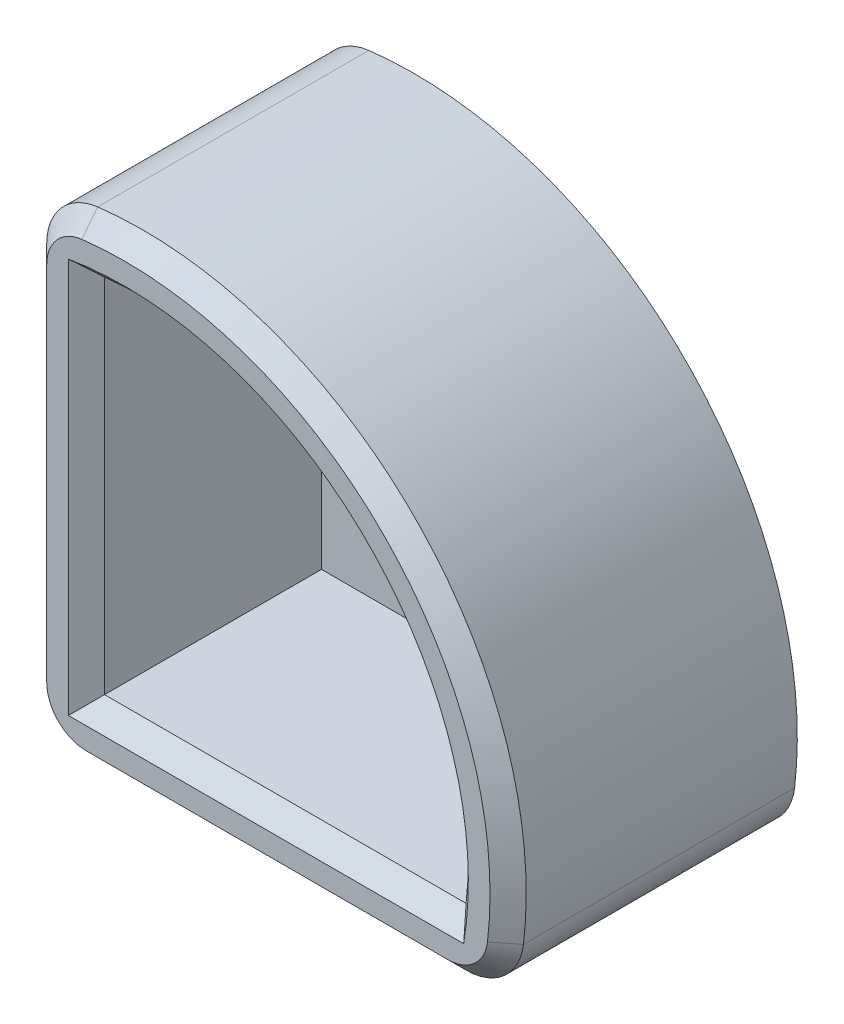
ISO-10303-21;
HEADER;
FILE_DESCRIPTION(('STEP AP214'),'2;1');
FILE_NAME('part.step','',(''),(''),'','','');
FILE_SCHEMA(('AUTOMOTIVE_DESIGN { 1 0 10303 214 1 1 1 1 }'));
ENDSEC;
DATA;
#1=APPLICATION_CONTEXT('core data for automotive mechanical design processes');
#2=APPLICATION_PROTOCOL_DEFINITION('international standard','automotive_design',2000,#1);
#3=PRODUCT_CONTEXT('',#1,'mechanical');
#4=PRODUCT('Part','Part','',(#3));
#5=PRODUCT_RELATED_PRODUCT_CATEGORY('part','',(#4));
#6=PRODUCT_DEFINITION_FORMATION('','',#4);
#7=PRODUCT_DEFINITION_CONTEXT('part definition',#1,'design');
#8=PRODUCT_DEFINITION('design','',#6,#7);
#9=PRODUCT_DEFINITION_SHAPE('','',#8);
#10=(LENGTH_UNIT() NAMED_UNIT(*) SI_UNIT(.MILLI.,.METRE.));
#11=(NAMED_UNIT(*) PLANE_ANGLE_UNIT() SI_UNIT($,.RADIAN.));
#12=(NAMED_UNIT(*) SI_UNIT($,.STERADIAN.) SOLID_ANGLE_UNIT());
#13=UNCERTAINTY_MEASURE_WITH_UNIT(LENGTH_MEASURE(1.E-05),#10,'distance_accuracy_value','');
#14=(GEOMETRIC_REPRESENTATION_CONTEXT(3) GLOBAL_UNCERTAINTY_ASSIGNED_CONTEXT((#13)) GLOBAL_UNIT_ASSIGNED_CONTEXT((#10,
#11,#12)) REPRESENTATION_CONTEXT('',''));
#15=CARTESIAN_POINT('',(0.,0.,0.));
#16=DIRECTION('',(0.,0.,1.));
#17=DIRECTION('',(1.,0.,0.));
#18=AXIS2_PLACEMENT_3D('',#15,#16,#17);
#19=CARTESIAN_POINT('',(-1.6,-1.6,8.));
#20=DIRECTION('',(1.,0.,0.));
#21=DIRECTION('',(0.,1.,0.));
#22=AXIS2_PLACEMENT_3D('',#19,#20,#21);
#23=PLANE('',#22);
#24=DIRECTION('',(0.,0.,-1.));
#25=VECTOR('',#24,1.);
#26=CARTESIAN_POINT('',(-1.6,0.,8.));
#27=LINE('',#26,#25);
#28=CARTESIAN_POINT('',(-1.6,0.,0.));
#29=VERTEX_POINT('',#28);
#30=CARTESIAN_POINT('',(-1.6,0.,7.5));
#31=VERTEX_POINT('',#30);
#32=EDGE_CURVE('E226',#29,#31,#27,.F.);
#33=ORIENTED_EDGE('',*,*,#32,.T.);
#34=DIRECTION('',(0.,1.,0.));
#35=VECTOR('',#34,1.);
#36=CARTESIAN_POINT('',(-1.6,-1.6,7.5));
#37=LINE('',#36,#35);
#38=CARTESIAN_POINT('',(-1.6,10.,7.5));
#39=VERTEX_POINT('',#38);
#40=EDGE_CURVE('E274',#31,#39,#37,.T.);
#41=ORIENTED_EDGE('',*,*,#40,.T.);
#42=DIRECTION('',(0.,0.,-1.));
#43=VECTOR('',#42,1.);
#44=CARTESIAN_POINT('',(-1.6,10.,8.));
#45=LINE('',#44,#43);
#46=CARTESIAN_POINT('',(-1.6,10.,0.));
#47=VERTEX_POINT('',#46);
#48=EDGE_CURVE('E229',#39,#47,#45,.T.);
#49=ORIENTED_EDGE('',*,*,#48,.T.);
#50=DIRECTION('',(0.,-1.,0.));
#51=VECTOR('',#50,1.);
#52=CARTESIAN_POINT('',(-1.6,-1.6,0.));
#53=LINE('',#52,#51);
#54=EDGE_CURVE('E214',#47,#29,#53,.T.);
#55=ORIENTED_EDGE('',*,*,#54,.T.);
#56=EDGE_LOOP('',(#33,#41,#49,#55));
#57=FACE_BOUND('',#56,.T.);
#58=ADVANCED_FACE('F35',(#57),#23,.F.);
#59=CARTESIAN_POINT('',(-1.6,-1.6,8.));
#60=DIRECTION('',(0.,1.,0.));
#61=DIRECTION('',(-1.,0.,0.));
#62=AXIS2_PLACEMENT_3D('',#59,#60,#61);
#63=PLANE('',#62);
#64=DIRECTION('',(0.,0.,-1.));
#65=VECTOR('',#64,1.);
#66=CARTESIAN_POINT('',(10.,-1.6,8.));
#67=LINE('',#66,#65);
#68=CARTESIAN_POINT('',(10.,-1.6,0.));
#69=VERTEX_POINT('',#68);
#70=CARTESIAN_POINT('',(10.,-1.6,7.5));
#71=VERTEX_POINT('',#70);
#72=EDGE_CURVE('E242',#69,#71,#67,.F.);
#73=ORIENTED_EDGE('',*,*,#72,.T.);
#74=DIRECTION('',(-1.,0.,0.));
#75=VECTOR('',#74,1.);
#76=CARTESIAN_POINT('',(-1.6,-1.6,7.5));
#77=LINE('',#76,#75);
#78=CARTESIAN_POINT('',(0.,-1.6,7.5));
#79=VERTEX_POINT('',#78);
#80=EDGE_CURVE('E270',#71,#79,#77,.T.);
#81=ORIENTED_EDGE('',*,*,#80,.T.);
#82=DIRECTION('',(0.,0.,-1.));
#83=VECTOR('',#82,1.);
#84=CARTESIAN_POINT('',(0.,-1.6,8.));
#85=LINE('',#84,#83);
#86=CARTESIAN_POINT('',(0.,-1.6,0.));
#87=VERTEX_POINT('',#86);
#88=EDGE_CURVE('E245',#79,#87,#85,.T.);
#89=ORIENTED_EDGE('',*,*,#88,.T.);
#90=DIRECTION('',(1.,0.,0.));
#91=VECTOR('',#90,1.);
#92=CARTESIAN_POINT('',(-1.6,-1.6,0.));
#93=LINE('',#92,#91);
#94=EDGE_CURVE('E220',#87,#69,#93,.T.);
#95=ORIENTED_EDGE('',*,*,#94,.T.);
#96=EDGE_LOOP('',(#73,#81,#89,#95));
#97=FACE_BOUND('',#96,.T.);
#98=ADVANCED_FACE('F324',(#97),#63,.F.);
#99=CARTESIAN_POINT('',(1.0629960629941,1.0629960629941,8.));
#100=DIRECTION('',(0.,0.,-1.));
#101=DIRECTION('',(-1.,0.,0.));
#102=AXIS2_PLACEMENT_3D('',#99,#100,#101);
#103=CYLINDRICAL_SURFACE('',#102,10.6);
#104=DIRECTION('',(0.,0.,-1.));
#105=VECTOR('',#104,1.);
#106=CARTESIAN_POINT('',(-0.188977077865617,11.5888006999122,8.));
#107=LINE('',#106,#105);
#108=CARTESIAN_POINT('',(-0.188977077865617,11.5888006999122,0.));
#109=VERTEX_POINT('',#108);
#110=CARTESIAN_POINT('',(-0.188977077865617,11.5888006999122,7.5));
#111=VERTEX_POINT('',#110);
#112=EDGE_CURVE('E239',#109,#111,#107,.F.);
#113=ORIENTED_EDGE('',*,*,#112,.T.);
#114=CARTESIAN_POINT('',(1.0629960629941,1.0629960629941,7.5));
#115=DIRECTION('',(0.,0.,-1.));
#116=DIRECTION('',(-1.,0.,0.));
#117=AXIS2_PLACEMENT_3D('',#114,#115,#116);
#118=CIRCLE('',#117,10.6);
#119=CARTESIAN_POINT('',(11.5888006999122,-0.188977077865617,7.5));
#120=VERTEX_POINT('',#119);
#121=EDGE_CURVE('E278',#111,#120,#118,.T.);
#122=ORIENTED_EDGE('',*,*,#121,.T.);
#123=DIRECTION('',(0.,0.,-1.));
#124=VECTOR('',#123,1.);
#125=CARTESIAN_POINT('',(11.5888006999122,-0.188977077865617,8.));
#126=LINE('',#125,#124);
#127=CARTESIAN_POINT('',(11.5888006999122,-0.188977077865617,0.));
#128=VERTEX_POINT('',#127);
#129=EDGE_CURVE('E237',#120,#128,#126,.T.);
#130=ORIENTED_EDGE('',*,*,#129,.T.);
#131=CARTESIAN_POINT('',(1.0629960629941,1.0629960629941,0.));
#132=DIRECTION('',(0.,0.,1.));
#133=DIRECTION('',(-1.,0.,0.));
#134=AXIS2_PLACEMENT_3D('',#131,#132,#133);
#135=CIRCLE('',#134,10.6);
#136=EDGE_CURVE('E223',#128,#109,#135,.T.);
#137=ORIENTED_EDGE('',*,*,#136,.T.);
#138=EDGE_LOOP('',(#113,#122,#130,#137));
#139=FACE_BOUND('',#138,.T.);
#140=ADVANCED_FACE('F330',(#139),#103,.T.);
#141=CARTESIAN_POINT('',(1.0629960629941,1.0629960629941,8.));
#142=DIRECTION('',(0.,0.,-1.));
#143=DIRECTION('',(-1.,0.,0.));
#144=AXIS2_PLACEMENT_3D('',#141,#142,#143);
#145=PLANE('',#144);
#146=DIRECTION('',(1.,0.,0.));
#147=VECTOR('',#146,1.);
#148=CARTESIAN_POINT('',(1.0629960629941,-1.1,8.));
#149=LINE('',#148,#147);
#150=CARTESIAN_POINT('',(0.,-1.1,8.));
#151=VERTEX_POINT('',#150);
#152=CARTESIAN_POINT('',(10.,-1.1,8.));
#153=VERTEX_POINT('',#152);
#154=EDGE_CURVE('E262',#151,#153,#149,.T.);
#155=ORIENTED_EDGE('',*,*,#154,.T.);
#156=CARTESIAN_POINT('',(10.,0.,8.));
#157=DIRECTION('',(0.,0.,-1.));
#158=DIRECTION('',(-1.,0.,0.));
#159=AXIS2_PLACEMENT_3D('',#156,#157,#158);
#160=CIRCLE('',#159,1.1);
#161=CARTESIAN_POINT('',(11.0923004811896,-0.129921741032612,8.));
#162=VERTEX_POINT('',#161);
#163=EDGE_CURVE('E264',#153,#162,#160,.F.);
#164=ORIENTED_EDGE('',*,*,#163,.T.);
#165=CARTESIAN_POINT('',(1.0629960629941,1.0629960629941,8.));
#166=DIRECTION('',(0.,0.,-1.));
#167=DIRECTION('',(-1.,0.,0.));
#168=AXIS2_PLACEMENT_3D('',#165,#166,#167);
#169=CIRCLE('',#168,10.1);
#170=CARTESIAN_POINT('',(-0.129921741032612,11.0923004811896,8.));
#171=VERTEX_POINT('',#170);
#172=EDGE_CURVE('E254',#162,#171,#169,.F.);
#173=ORIENTED_EDGE('',*,*,#172,.T.);
#174=CARTESIAN_POINT('',(0.,10.,8.));
#175=DIRECTION('',(0.,0.,-1.));
#176=DIRECTION('',(-1.,0.,0.));
#177=AXIS2_PLACEMENT_3D('',#174,#175,#176);
#178=CIRCLE('',#177,1.1);
#179=CARTESIAN_POINT('',(-1.1,10.,8.));
#180=VERTEX_POINT('',#179);
#181=EDGE_CURVE('E256',#171,#180,#178,.F.);
#182=ORIENTED_EDGE('',*,*,#181,.T.);
#183=DIRECTION('',(0.,-1.,0.));
#184=VECTOR('',#183,1.);
#185=CARTESIAN_POINT('',(-1.1,1.0629960629941,8.));
#186=LINE('',#185,#184);
#187=CARTESIAN_POINT('',(-1.1,0.,8.));
#188=VERTEX_POINT('',#187);
#189=EDGE_CURVE('E258',#180,#188,#186,.T.);
#190=ORIENTED_EDGE('',*,*,#189,.T.);
#191=CARTESIAN_POINT('',(0.,0.,8.));
#192=DIRECTION('',(0.,0.,-1.));
#193=DIRECTION('',(-1.,0.,0.));
#194=AXIS2_PLACEMENT_3D('',#191,#192,#193);
#195=CIRCLE('',#194,1.1);
#196=EDGE_CURVE('E260',#188,#151,#195,.F.);
#197=ORIENTED_EDGE('',*,*,#196,.T.);
#198=EDGE_LOOP('',(#155,#164,#173,#182,#190,#197));
#199=FACE_BOUND('',#198,.T.);
#200=DIRECTION('',(0.,1.,0.));
#201=VECTOR('',#200,1.);
#202=CARTESIAN_POINT('',(-0.500000000000003,1.0629960629941,8.));
#203=LINE('',#202,#201);
#204=CARTESIAN_POINT('',(-0.500000000000003,-0.500000000000003,8.));
#205=VERTEX_POINT('',#204);
#206=CARTESIAN_POINT('',(-0.500000000000003,10.4335373124132,8.));
#207=VERTEX_POINT('',#206);
#208=EDGE_CURVE('E249',#205,#207,#203,.T.);
#209=ORIENTED_EDGE('',*,*,#208,.T.);
#210=CARTESIAN_POINT('',(1.0629960629941,1.0629960629941,8.));
#211=DIRECTION('',(0.,0.,-1.));
#212=DIRECTION('',(-1.,0.,0.));
#213=AXIS2_PLACEMENT_3D('',#210,#211,#212);
#214=CIRCLE('',#213,9.5);
#215=CARTESIAN_POINT('',(10.4335373124132,-0.500000000000003,8.));
#216=VERTEX_POINT('',#215);
#217=EDGE_CURVE('E251',#207,#216,#214,.T.);
#218=ORIENTED_EDGE('',*,*,#217,.T.);
#219=DIRECTION('',(-1.,0.,0.));
#220=VECTOR('',#219,1.);
#221=CARTESIAN_POINT('',(1.0629960629941,-0.500000000000003,8.));
#222=LINE('',#221,#220);
#223=EDGE_CURVE('E247',#216,#205,#222,.T.);
#224=ORIENTED_EDGE('',*,*,#223,.T.);
#225=EDGE_LOOP('',(#209,#218,#224));
#226=FACE_BOUND('',#225,.T.);
#227=ADVANCED_FACE('F398',(#199,#226),#145,.F.);
#228=CARTESIAN_POINT('',(1.0629960629941,1.0629960629941,0.));
#229=DIRECTION('',(0.,0.,-1.));
#230=DIRECTION('',(-1.,0.,0.));
#231=AXIS2_PLACEMENT_3D('',#228,#229,#230);
#232=PLANE('',#231);
#233=CARTESIAN_POINT('',(3.5,5.5,0.));
#234=DIRECTION('',(0.,0.,1.));
#235=DIRECTION('',(1.,0.,0.));
#236=AXIS2_PLACEMENT_3D('',#233,#234,#235);
#237=CIRCLE('',#236,1.25);
#238=CARTESIAN_POINT('',(4.38388347648319,6.38388347648318,0.));
#239=VERTEX_POINT('',#238);
#240=CARTESIAN_POINT('',(2.61611652351682,4.61611652351682,0.));
#241=VERTEX_POINT('',#240);
#242=EDGE_CURVE('E162',#239,#241,#237,.T.);
#243=ORIENTED_EDGE('',*,*,#242,.T.);
#244=DIRECTION('',(0.707106781186547,-0.707106781186548,0.));
#245=VECTOR('',#244,1.);
#246=CARTESIAN_POINT('',(2.61611652351682,4.61611652351682,0.));
#247=LINE('',#246,#245);
#248=CARTESIAN_POINT('',(4.61611652351682,2.61611652351682,0.));
#249=VERTEX_POINT('',#248);
#250=EDGE_CURVE('E174',#241,#249,#247,.T.);
#251=ORIENTED_EDGE('',*,*,#250,.T.);
#252=CARTESIAN_POINT('',(5.5,3.5,0.));
#253=DIRECTION('',(0.,0.,1.));
#254=DIRECTION('',(1.,0.,0.));
#255=AXIS2_PLACEMENT_3D('',#252,#253,#254);
#256=CIRCLE('',#255,1.25);
#257=CARTESIAN_POINT('',(6.38388347648318,4.38388347648319,0.));
#258=VERTEX_POINT('',#257);
#259=EDGE_CURVE('E178',#249,#258,#256,.T.);
#260=ORIENTED_EDGE('',*,*,#259,.T.);
#261=DIRECTION('',(-0.707106781186548,0.707106781186548,0.));
#262=VECTOR('',#261,1.);
#263=CARTESIAN_POINT('',(4.38388347648319,6.38388347648318,0.));
#264=LINE('',#263,#262);
#265=EDGE_CURVE('E170',#258,#239,#264,.T.);
#266=ORIENTED_EDGE('',*,*,#265,.T.);
#267=EDGE_LOOP('',(#243,#251,#260,#266));
#268=FACE_BOUND('',#267,.T.);
#269=ORIENTED_EDGE('',*,*,#54,.F.);
#270=CARTESIAN_POINT('',(0.,10.,0.));
#271=DIRECTION('',(0.,0.,-1.));
#272=DIRECTION('',(-1.,0.,0.));
#273=AXIS2_PLACEMENT_3D('',#270,#271,#272);
#274=CIRCLE('',#273,1.6);
#275=EDGE_CURVE('E235',#47,#109,#274,.T.);
#276=ORIENTED_EDGE('',*,*,#275,.T.);
#277=ORIENTED_EDGE('',*,*,#136,.F.);
#278=CARTESIAN_POINT('',(10.,0.,0.));
#279=DIRECTION('',(0.,0.,-1.));
#280=DIRECTION('',(-1.,0.,0.));
#281=AXIS2_PLACEMENT_3D('',#278,#279,#280);
#282=CIRCLE('',#281,1.6);
#283=EDGE_CURVE('E231',#128,#69,#282,.T.);
#284=ORIENTED_EDGE('',*,*,#283,.T.);
#285=ORIENTED_EDGE('',*,*,#94,.F.);
#286=CARTESIAN_POINT('',(0.,0.,0.));
#287=DIRECTION('',(0.,0.,-1.));
#288=DIRECTION('',(-1.,0.,0.));
#289=AXIS2_PLACEMENT_3D('',#286,#287,#288);
#290=CIRCLE('',#289,1.6);
#291=EDGE_CURVE('E233',#87,#29,#290,.T.);
#292=ORIENTED_EDGE('',*,*,#291,.T.);
#293=EDGE_LOOP('',(#269,#276,#277,#284,#285,#292));
#294=FACE_BOUND('',#293,.T.);
#295=ADVANCED_FACE('F180',(#268,#294),#232,.T.);
#296=CARTESIAN_POINT('',(0.,0.,1.5));
#297=DIRECTION('',(-1.,0.,0.));
#298=DIRECTION('',(0.,0.,1.));
#299=AXIS2_PLACEMENT_3D('',#296,#297,#298);
#300=PLANE('',#299);
#301=DIRECTION('',(0.,0.,1.));
#302=VECTOR('',#301,1.);
#303=CARTESIAN_POINT('',(0.,10.,1.5));
#304=LINE('',#303,#302);
#305=CARTESIAN_POINT('',(0.,10.,1.5));
#306=VERTEX_POINT('',#305);
#307=CARTESIAN_POINT('',(0.,10.,7.5));
#308=VERTEX_POINT('',#307);
#309=EDGE_CURVE('E212',#306,#308,#304,.T.);
#310=ORIENTED_EDGE('',*,*,#309,.T.);
#311=DIRECTION('',(0.,-1.,0.));
#312=VECTOR('',#311,1.);
#313=CARTESIAN_POINT('',(0.,0.,7.5));
#314=LINE('',#313,#312);
#315=CARTESIAN_POINT('',(0.,0.,7.5));
#316=VERTEX_POINT('',#315);
#317=EDGE_CURVE('E45',#308,#316,#314,.T.);
#318=ORIENTED_EDGE('',*,*,#317,.T.);
#319=DIRECTION('',(0.,0.,1.));
#320=VECTOR('',#319,1.);
#321=CARTESIAN_POINT('',(0.,0.,1.5));
#322=LINE('',#321,#320);
#323=CARTESIAN_POINT('',(0.,0.,1.5));
#324=VERTEX_POINT('',#323);
#325=EDGE_CURVE('E211',#324,#316,#322,.T.);
#326=ORIENTED_EDGE('',*,*,#325,.F.);
#327=DIRECTION('',(0.,-1.,0.));
#328=VECTOR('',#327,1.);
#329=CARTESIAN_POINT('',(0.,0.,1.5));
#330=LINE('',#329,#328);
#331=EDGE_CURVE('E199',#306,#324,#330,.T.);
#332=ORIENTED_EDGE('',*,*,#331,.F.);
#333=EDGE_LOOP('',(#310,#318,#326,#332));
#334=FACE_BOUND('',#333,.T.);
#335=ADVANCED_FACE('F417',(#334),#300,.F.);
#336=CARTESIAN_POINT('',(1.0629960629941,1.0629960629941,1.5));
#337=DIRECTION('',(0.,0.,1.));
#338=DIRECTION('',(1.,0.,0.));
#339=AXIS2_PLACEMENT_3D('',#336,#337,#338);
#340=CYLINDRICAL_SURFACE('',#339,9.);
#341=DIRECTION('',(0.,0.,1.));
#342=VECTOR('',#341,1.);
#343=CARTESIAN_POINT('',(10.,0.,1.5));
#344=LINE('',#343,#342);
#345=CARTESIAN_POINT('',(10.,0.,1.5));
#346=VERTEX_POINT('',#345);
#347=CARTESIAN_POINT('',(10.,0.,7.5));
#348=VERTEX_POINT('',#347);
#349=EDGE_CURVE('E215',#346,#348,#344,.T.);
#350=ORIENTED_EDGE('',*,*,#349,.T.);
#351=CARTESIAN_POINT('',(1.0629960629941,1.0629960629941,7.5));
#352=DIRECTION('',(0.,0.,-1.));
#353=DIRECTION('',(-1.,0.,0.));
#354=AXIS2_PLACEMENT_3D('',#351,#352,#353);
#355=CIRCLE('',#354,9.);
#356=EDGE_CURVE('E280',#348,#308,#355,.F.);
#357=ORIENTED_EDGE('',*,*,#356,.T.);
#358=ORIENTED_EDGE('',*,*,#309,.F.);
#359=CARTESIAN_POINT('',(1.0629960629941,1.0629960629941,1.5));
#360=DIRECTION('',(0.,0.,1.));
#361=DIRECTION('',(-1.,0.,0.));
#362=AXIS2_PLACEMENT_3D('',#359,#360,#361);
#363=CIRCLE('',#362,9.);
#364=EDGE_CURVE('E208',#346,#306,#363,.T.);
#365=ORIENTED_EDGE('',*,*,#364,.F.);
#366=EDGE_LOOP('',(#350,#357,#358,#365));
#367=FACE_BOUND('',#366,.T.);
#368=ADVANCED_FACE('F414',(#367),#340,.F.);
#369=CARTESIAN_POINT('',(0.,0.,1.5));
#370=DIRECTION('',(0.,-1.,0.));
#371=DIRECTION('',(0.,0.,-1.));
#372=AXIS2_PLACEMENT_3D('',#369,#370,#371);
#373=PLANE('',#372);
#374=ORIENTED_EDGE('',*,*,#325,.T.);
#375=DIRECTION('',(1.,0.,0.));
#376=VECTOR('',#375,1.);
#377=CARTESIAN_POINT('',(0.,0.,7.5));
#378=LINE('',#377,#376);
#379=EDGE_CURVE('E11',#316,#348,#378,.T.);
#380=ORIENTED_EDGE('',*,*,#379,.T.);
#381=ORIENTED_EDGE('',*,*,#349,.F.);
#382=DIRECTION('',(1.,0.,0.));
#383=VECTOR('',#382,1.);
#384=CARTESIAN_POINT('',(0.,0.,1.5));
#385=LINE('',#384,#383);
#386=EDGE_CURVE('E205',#324,#346,#385,.T.);
#387=ORIENTED_EDGE('',*,*,#386,.F.);
#388=EDGE_LOOP('',(#374,#380,#381,#387));
#389=FACE_BOUND('',#388,.T.);
#390=ADVANCED_FACE('F421',(#389),#373,.F.);
#391=CARTESIAN_POINT('',(1.0629960629941,1.0629960629941,1.5));
#392=DIRECTION('',(0.,0.,-1.));
#393=DIRECTION('',(-1.,0.,0.));
#394=AXIS2_PLACEMENT_3D('',#391,#392,#393);
#395=PLANE('',#394);
#396=DIRECTION('',(0.707106781186547,-0.707106781186548,0.));
#397=VECTOR('',#396,1.);
#398=CARTESIAN_POINT('',(2.61611652351682,4.61611652351682,1.5));
#399=LINE('',#398,#397);
#400=CARTESIAN_POINT('',(2.61611652351682,4.61611652351682,1.5));
#401=VERTEX_POINT('',#400);
#402=CARTESIAN_POINT('',(4.61611652351682,2.61611652351682,1.5));
#403=VERTEX_POINT('',#402);
#404=EDGE_CURVE('E192',#401,#403,#399,.T.);
#405=ORIENTED_EDGE('',*,*,#404,.F.);
#406=CARTESIAN_POINT('',(3.5,5.5,1.5));
#407=DIRECTION('',(0.,0.,1.));
#408=DIRECTION('',(1.,0.,0.));
#409=AXIS2_PLACEMENT_3D('',#406,#407,#408);
#410=CIRCLE('',#409,1.25);
#411=CARTESIAN_POINT('',(4.38388347648319,6.38388347648318,1.5));
#412=VERTEX_POINT('',#411);
#413=EDGE_CURVE('E165',#412,#401,#410,.T.);
#414=ORIENTED_EDGE('',*,*,#413,.F.);
#415=DIRECTION('',(-0.707106781186548,0.707106781186548,0.));
#416=VECTOR('',#415,1.);
#417=CARTESIAN_POINT('',(4.38388347648319,6.38388347648318,1.5));
#418=LINE('',#417,#416);
#419=CARTESIAN_POINT('',(6.38388347648318,4.38388347648319,1.5));
#420=VERTEX_POINT('',#419);
#421=EDGE_CURVE('E183',#420,#412,#418,.T.);
#422=ORIENTED_EDGE('',*,*,#421,.F.);
#423=CARTESIAN_POINT('',(5.5,3.5,1.5));
#424=DIRECTION('',(0.,0.,1.));
#425=DIRECTION('',(1.,0.,0.));
#426=AXIS2_PLACEMENT_3D('',#423,#424,#425);
#427=CIRCLE('',#426,1.25);
#428=EDGE_CURVE('E186',#403,#420,#427,.T.);
#429=ORIENTED_EDGE('',*,*,#428,.F.);
#430=EDGE_LOOP('',(#405,#414,#422,#429));
#431=FACE_BOUND('',#430,.T.);
#432=ORIENTED_EDGE('',*,*,#331,.T.);
#433=ORIENTED_EDGE('',*,*,#386,.T.);
#434=ORIENTED_EDGE('',*,*,#364,.T.);
#435=EDGE_LOOP('',(#432,#433,#434));
#436=FACE_BOUND('',#435,.T.);
#437=ADVANCED_FACE('F420',(#431,#436),#395,.F.);
#438=CARTESIAN_POINT('',(3.5,5.5,0.));
#439=DIRECTION('',(0.,0.,1.));
#440=DIRECTION('',(1.,0.,0.));
#441=AXIS2_PLACEMENT_3D('',#438,#439,#440);
#442=CYLINDRICAL_SURFACE('',#441,1.25);
#443=ORIENTED_EDGE('',*,*,#413,.T.);
#444=DIRECTION('',(0.,0.,1.));
#445=VECTOR('',#444,1.);
#446=CARTESIAN_POINT('',(2.61611652351682,4.61611652351682,0.));
#447=LINE('',#446,#445);
#448=EDGE_CURVE('E158',#241,#401,#447,.T.);
#449=ORIENTED_EDGE('',*,*,#448,.F.);
#450=ORIENTED_EDGE('',*,*,#242,.F.);
#451=DIRECTION('',(0.,0.,1.));
#452=VECTOR('',#451,1.);
#453=CARTESIAN_POINT('',(4.38388347648319,6.38388347648318,0.));
#454=LINE('',#453,#452);
#455=EDGE_CURVE('E197',#239,#412,#454,.T.);
#456=ORIENTED_EDGE('',*,*,#455,.T.);
#457=EDGE_LOOP('',(#443,#449,#450,#456));
#458=FACE_BOUND('',#457,.T.);
#459=ADVANCED_FACE('F160',(#458),#442,.F.);
#460=CARTESIAN_POINT('',(4.38388347648319,6.38388347648318,0.));
#461=DIRECTION('',(0.707106781186548,0.707106781186548,0.));
#462=DIRECTION('',(-0.707106781186548,0.707106781186548,0.));
#463=AXIS2_PLACEMENT_3D('',#460,#461,#462);
#464=PLANE('',#463);
#465=ORIENTED_EDGE('',*,*,#421,.T.);
#466=ORIENTED_EDGE('',*,*,#455,.F.);
#467=ORIENTED_EDGE('',*,*,#265,.F.);
#468=DIRECTION('',(0.,0.,1.));
#469=VECTOR('',#468,1.);
#470=CARTESIAN_POINT('',(6.38388347648318,4.38388347648319,0.));
#471=LINE('',#470,#469);
#472=EDGE_CURVE('E200',#258,#420,#471,.T.);
#473=ORIENTED_EDGE('',*,*,#472,.T.);
#474=EDGE_LOOP('',(#465,#466,#467,#473));
#475=FACE_BOUND('',#474,.T.);
#476=ADVANCED_FACE('F544',(#475),#464,.F.);
#477=CARTESIAN_POINT('',(5.5,3.5,0.));
#478=DIRECTION('',(0.,0.,1.));
#479=DIRECTION('',(1.,0.,0.));
#480=AXIS2_PLACEMENT_3D('',#477,#478,#479);
#481=CYLINDRICAL_SURFACE('',#480,1.25);
#482=ORIENTED_EDGE('',*,*,#428,.T.);
#483=ORIENTED_EDGE('',*,*,#472,.F.);
#484=ORIENTED_EDGE('',*,*,#259,.F.);
#485=DIRECTION('',(0.,0.,1.));
#486=VECTOR('',#485,1.);
#487=CARTESIAN_POINT('',(4.61611652351682,2.61611652351682,0.));
#488=LINE('',#487,#486);
#489=EDGE_CURVE('E169',#249,#403,#488,.T.);
#490=ORIENTED_EDGE('',*,*,#489,.T.);
#491=EDGE_LOOP('',(#482,#483,#484,#490));
#492=FACE_BOUND('',#491,.T.);
#493=ADVANCED_FACE('F538',(#492),#481,.F.);
#494=CARTESIAN_POINT('',(2.61611652351682,4.61611652351682,0.));
#495=DIRECTION('',(-0.707106781186548,-0.707106781186547,0.));
#496=DIRECTION('',(0.707106781186547,-0.707106781186548,0.));
#497=AXIS2_PLACEMENT_3D('',#494,#495,#496);
#498=PLANE('',#497);
#499=ORIENTED_EDGE('',*,*,#404,.T.);
#500=ORIENTED_EDGE('',*,*,#489,.F.);
#501=ORIENTED_EDGE('',*,*,#250,.F.);
#502=ORIENTED_EDGE('',*,*,#448,.T.);
#503=EDGE_LOOP('',(#499,#500,#501,#502));
#504=FACE_BOUND('',#503,.T.);
#505=ADVANCED_FACE('F175',(#504),#498,.F.);
#506=CARTESIAN_POINT('',(0.,10.,8.));
#507=DIRECTION('',(0.,0.,-1.));
#508=DIRECTION('',(-1.,0.,0.));
#509=AXIS2_PLACEMENT_3D('',#506,#507,#508);
#510=CYLINDRICAL_SURFACE('',#509,1.6);
#511=ORIENTED_EDGE('',*,*,#48,.F.);
#512=CARTESIAN_POINT('',(0.,10.,7.5));
#513=DIRECTION('',(0.,0.,-1.));
#514=DIRECTION('',(-1.,0.,0.));
#515=AXIS2_PLACEMENT_3D('',#512,#513,#514);
#516=CIRCLE('',#515,1.6);
#517=EDGE_CURVE('E276',#39,#111,#516,.T.);
#518=ORIENTED_EDGE('',*,*,#517,.T.);
#519=ORIENTED_EDGE('',*,*,#112,.F.);
#520=ORIENTED_EDGE('',*,*,#275,.F.);
#521=EDGE_LOOP('',(#511,#518,#519,#520));
#522=FACE_BOUND('',#521,.T.);
#523=ADVANCED_FACE('F335',(#522),#510,.T.);
#524=CARTESIAN_POINT('',(0.,0.,8.));
#525=DIRECTION('',(0.,0.,-1.));
#526=DIRECTION('',(-1.,0.,0.));
#527=AXIS2_PLACEMENT_3D('',#524,#525,#526);
#528=CYLINDRICAL_SURFACE('',#527,1.6);
#529=ORIENTED_EDGE('',*,*,#88,.F.);
#530=CARTESIAN_POINT('',(0.,0.,7.5));
#531=DIRECTION('',(0.,0.,-1.));
#532=DIRECTION('',(-1.,0.,0.));
#533=AXIS2_PLACEMENT_3D('',#530,#531,#532);
#534=CIRCLE('',#533,1.6);
#535=EDGE_CURVE('E272',#79,#31,#534,.T.);
#536=ORIENTED_EDGE('',*,*,#535,.T.);
#537=ORIENTED_EDGE('',*,*,#32,.F.);
#538=ORIENTED_EDGE('',*,*,#291,.F.);
#539=EDGE_LOOP('',(#529,#536,#537,#538));
#540=FACE_BOUND('',#539,.T.);
#541=ADVANCED_FACE('F338',(#540),#528,.T.);
#542=CARTESIAN_POINT('',(10.,0.,8.));
#543=DIRECTION('',(0.,0.,-1.));
#544=DIRECTION('',(-1.,0.,0.));
#545=AXIS2_PLACEMENT_3D('',#542,#543,#544);
#546=CYLINDRICAL_SURFACE('',#545,1.6);
#547=ORIENTED_EDGE('',*,*,#129,.F.);
#548=CARTESIAN_POINT('',(10.,0.,7.5));
#549=DIRECTION('',(0.,0.,-1.));
#550=DIRECTION('',(-1.,0.,0.));
#551=AXIS2_PLACEMENT_3D('',#548,#549,#550);
#552=CIRCLE('',#551,1.6);
#553=EDGE_CURVE('E267',#120,#71,#552,.T.);
#554=ORIENTED_EDGE('',*,*,#553,.T.);
#555=ORIENTED_EDGE('',*,*,#72,.F.);
#556=ORIENTED_EDGE('',*,*,#283,.F.);
#557=EDGE_LOOP('',(#547,#554,#555,#556));
#558=FACE_BOUND('',#557,.T.);
#559=ADVANCED_FACE('F342',(#558),#546,.T.);
#560=CARTESIAN_POINT('',(-1.1,1.0629960629941,8.));
#561=DIRECTION('',(0.70710678118655,0.,-0.707106781186545));
#562=DIRECTION('',(0.,-1.,0.));
#563=AXIS2_PLACEMENT_3D('',#560,#561,#562);
#564=PLANE('',#563);
#565=DIRECTION('',(0.707106781186545,0.,0.70710678118655));
#566=VECTOR('',#565,1.);
#567=CARTESIAN_POINT('',(-1.6,10.,7.5));
#568=LINE('',#567,#566);
#569=EDGE_CURVE('E294',#39,#180,#568,.T.);
#570=ORIENTED_EDGE('',*,*,#569,.F.);
#571=ORIENTED_EDGE('',*,*,#40,.F.);
#572=DIRECTION('',(-0.707106781186545,0.,-0.70710678118655));
#573=VECTOR('',#572,1.);
#574=CARTESIAN_POINT('',(-1.1,0.,8.));
#575=LINE('',#574,#573);
#576=EDGE_CURVE('E193',#188,#31,#575,.T.);
#577=ORIENTED_EDGE('',*,*,#576,.F.);
#578=ORIENTED_EDGE('',*,*,#189,.F.);
#579=EDGE_LOOP('',(#570,#571,#577,#578));
#580=FACE_BOUND('',#579,.T.);
#581=ADVANCED_FACE('F346',(#580),#564,.F.);
#582=CARTESIAN_POINT('',(0.,0.,8.));
#583=DIRECTION('',(0.,0.,-1.));
#584=DIRECTION('',(-1.,0.,0.));
#585=AXIS2_PLACEMENT_3D('',#582,#583,#584);
#586=CONICAL_SURFACE('',#585,1.1,0.785398163397445);
#587=ORIENTED_EDGE('',*,*,#576,.T.);
#588=ORIENTED_EDGE('',*,*,#535,.F.);
#589=DIRECTION('',(0.,-0.707106781186545,-0.70710678118655));
#590=VECTOR('',#589,1.);
#591=CARTESIAN_POINT('',(0.,-1.1,8.));
#592=LINE('',#591,#590);
#593=EDGE_CURVE('E291',#151,#79,#592,.T.);
#594=ORIENTED_EDGE('',*,*,#593,.F.);
#595=ORIENTED_EDGE('',*,*,#196,.F.);
#596=EDGE_LOOP('',(#587,#588,#594,#595));
#597=FACE_BOUND('',#596,.T.);
#598=ADVANCED_FACE('F362',(#597),#586,.T.);
#599=CARTESIAN_POINT('',(0.,10.,8.));
#600=DIRECTION('',(0.,0.,-1.));
#601=DIRECTION('',(-1.,0.,0.));
#602=AXIS2_PLACEMENT_3D('',#599,#600,#601);
#603=CONICAL_SURFACE('',#602,1.1,0.785398163397445);
#604=ORIENTED_EDGE('',*,*,#569,.T.);
#605=ORIENTED_EDGE('',*,*,#181,.F.);
#606=DIRECTION('',(0.0835168582797471,-0.702157343038636,0.70710678118655));
#607=VECTOR('',#606,1.);
#608=CARTESIAN_POINT('',(-0.188977077865617,11.5888006999122,7.5));
#609=LINE('',#608,#607);
#610=EDGE_CURVE('E288',#111,#171,#609,.T.);
#611=ORIENTED_EDGE('',*,*,#610,.F.);
#612=ORIENTED_EDGE('',*,*,#517,.F.);
#613=EDGE_LOOP('',(#604,#605,#611,#612));
#614=FACE_BOUND('',#613,.T.);
#615=ADVANCED_FACE('F358',(#614),#603,.T.);
#616=CARTESIAN_POINT('',(1.0629960629941,-1.1,8.));
#617=DIRECTION('',(0.,0.70710678118655,-0.707106781186545));
#618=DIRECTION('',(1.,0.,0.));
#619=AXIS2_PLACEMENT_3D('',#616,#617,#618);
#620=PLANE('',#619);
#621=ORIENTED_EDGE('',*,*,#593,.T.);
#622=ORIENTED_EDGE('',*,*,#80,.F.);
#623=DIRECTION('',(0.,-0.707106781186545,-0.70710678118655));
#624=VECTOR('',#623,1.);
#625=CARTESIAN_POINT('',(10.,-1.1,8.));
#626=LINE('',#625,#624);
#627=EDGE_CURVE('E286',#153,#71,#626,.T.);
#628=ORIENTED_EDGE('',*,*,#627,.F.);
#629=ORIENTED_EDGE('',*,*,#154,.F.);
#630=EDGE_LOOP('',(#621,#622,#628,#629));
#631=FACE_BOUND('',#630,.T.);
#632=ADVANCED_FACE('F354',(#631),#620,.F.);
#633=CARTESIAN_POINT('',(1.0629960629941,1.0629960629941,8.));
#634=DIRECTION('',(0.,0.,-1.));
#635=DIRECTION('',(-1.,0.,0.));
#636=AXIS2_PLACEMENT_3D('',#633,#634,#635);
#637=CONICAL_SURFACE('',#636,10.1,0.785398163397447);
#638=ORIENTED_EDGE('',*,*,#610,.T.);
#639=ORIENTED_EDGE('',*,*,#172,.F.);
#640=DIRECTION('',(-0.702157343038636,0.0835168582797471,0.70710678118655));
#641=VECTOR('',#640,1.);
#642=CARTESIAN_POINT('',(11.5888006999122,-0.188977077865617,7.5));
#643=LINE('',#642,#641);
#644=EDGE_CURVE('E284',#120,#162,#643,.T.);
#645=ORIENTED_EDGE('',*,*,#644,.F.);
#646=ORIENTED_EDGE('',*,*,#121,.F.);
#647=EDGE_LOOP('',(#638,#639,#645,#646));
#648=FACE_BOUND('',#647,.T.);
#649=ADVANCED_FACE('F350',(#648),#637,.T.);
#650=CARTESIAN_POINT('',(10.,0.,8.));
#651=DIRECTION('',(0.,0.,-1.));
#652=DIRECTION('',(-1.,0.,0.));
#653=AXIS2_PLACEMENT_3D('',#650,#651,#652);
#654=CONICAL_SURFACE('',#653,1.1,0.785398163397445);
#655=ORIENTED_EDGE('',*,*,#627,.T.);
#656=ORIENTED_EDGE('',*,*,#553,.F.);
#657=ORIENTED_EDGE('',*,*,#644,.T.);
#658=ORIENTED_EDGE('',*,*,#163,.F.);
#659=EDGE_LOOP('',(#655,#656,#657,#658));
#660=FACE_BOUND('',#659,.T.);
#661=ADVANCED_FACE('F320',(#660),#654,.T.);
#662=CARTESIAN_POINT('',(0.,0.,7.5));
#663=DIRECTION('',(0.,-0.707106781186547,-0.707106781186548));
#664=DIRECTION('',(1.,0.,0.));
#665=AXIS2_PLACEMENT_3D('',#662,#663,#664);
#666=PLANE('',#665);
#667=CARTESIAN_POINT('',(10.4335373124132,-0.500000000000003,8.));
#668=CARTESIAN_POINT('',(10.3625246581919,-0.416127621332181,7.91612762133218));
#669=CARTESIAN_POINT('',(10.2908902493668,-0.33252479648186,7.83252479648186));
#670=CARTESIAN_POINT('',(10.1463778137671,-0.165858129003862,7.66585812900386));
#671=CARTESIAN_POINT('',(10.0734997851212,-0.0827942871875137,7.58279428718751));
#672=CARTESIAN_POINT('',(10.,0.,7.5));
#673=B_SPLINE_CURVE_WITH_KNOTS('',3,(#667,#668,#669,#670,#671,#672),.UNSPECIFIED.,.F.,.F.,(4,2,
4),(0.,0.414720603012027,0.82944183015761),.UNSPECIFIED.);
#674=EDGE_CURVE('E304',#348,#216,#673,.F.);
#675=ORIENTED_EDGE('',*,*,#674,.F.);
#676=ORIENTED_EDGE('',*,*,#379,.F.);
#677=DIRECTION('',(-0.577350269189626,-0.577350269189626,0.577350269189625));
#678=VECTOR('',#677,1.);
#679=CARTESIAN_POINT('',(0.,0.,7.5));
#680=LINE('',#679,#678);
#681=EDGE_CURVE('E40',#205,#316,#680,.F.);
#682=ORIENTED_EDGE('',*,*,#681,.F.);
#683=ORIENTED_EDGE('',*,*,#223,.F.);
#684=EDGE_LOOP('',(#675,#676,#682,#683));
#685=FACE_BOUND('',#684,.T.);
#686=ADVANCED_FACE('F37',(#685),#666,.F.);
#687=CARTESIAN_POINT('',(0.,0.,7.5));
#688=DIRECTION('',(-0.707106781186547,0.,-0.707106781186548));
#689=DIRECTION('',(0.,-1.,0.));
#690=AXIS2_PLACEMENT_3D('',#687,#688,#689);
#691=PLANE('',#690);
#692=ORIENTED_EDGE('',*,*,#681,.T.);
#693=ORIENTED_EDGE('',*,*,#317,.F.);
#694=CARTESIAN_POINT('',(0.,10.,7.5));
#695=CARTESIAN_POINT('',(-0.082794287187515,10.0734997851212,7.58279428718751));
#696=CARTESIAN_POINT('',(-0.165858129003862,10.1463778137671,7.66585812900386));
#697=CARTESIAN_POINT('',(-0.332524796481859,10.2908902493668,7.83252479648186));
#698=CARTESIAN_POINT('',(-0.416127621332179,10.3625246581919,7.91612762133218));
#699=CARTESIAN_POINT('',(-0.5,10.4335373124132,8.));
#700=B_SPLINE_CURVE_WITH_KNOTS('',3,(#694,#695,#696,#697,#698,#699),.UNSPECIFIED.,.F.,.F.,(4,2,
4),(0.,0.414721227145582,0.829441830157611),.UNSPECIFIED.);
#701=EDGE_CURVE('E299',#207,#308,#700,.F.);
#702=ORIENTED_EDGE('',*,*,#701,.F.);
#703=ORIENTED_EDGE('',*,*,#208,.F.);
#704=EDGE_LOOP('',(#692,#693,#702,#703));
#705=FACE_BOUND('',#704,.T.);
#706=ADVANCED_FACE('F311',(#705),#691,.F.);
#707=CARTESIAN_POINT('',(1.0629960629941,1.0629960629941,7.5));
#708=DIRECTION('',(0.,0.,1.));
#709=DIRECTION('',(1.,0.,0.));
#710=AXIS2_PLACEMENT_3D('',#707,#708,#709);
#711=CONICAL_SURFACE('',#710,9.,0.78539816339745);
#712=ORIENTED_EDGE('',*,*,#674,.T.);
#713=ORIENTED_EDGE('',*,*,#217,.F.);
#714=ORIENTED_EDGE('',*,*,#701,.T.);
#715=ORIENTED_EDGE('',*,*,#356,.F.);
#716=EDGE_LOOP('',(#712,#713,#714,#715));
#717=FACE_BOUND('',#716,.T.);
#718=ADVANCED_FACE('F308',(#717),#711,.F.);
#719=CLOSED_SHELL('',(#58,#98,#140,#227,#295,#335,#368,#390,#437,#459,#476,#493,#505,#523,#541,
#559,#581,#598,#615,#632,#649,#661,#686,#706,#718));
#720=MANIFOLD_SOLID_BREP('B2',#719);
#721=ADVANCED_BREP_SHAPE_REPRESENTATION('',(#18,#720),#14);
#722=SHAPE_DEFINITION_REPRESENTATION(#9,#721);
ENDSEC;
END-ISO-10303-21;
